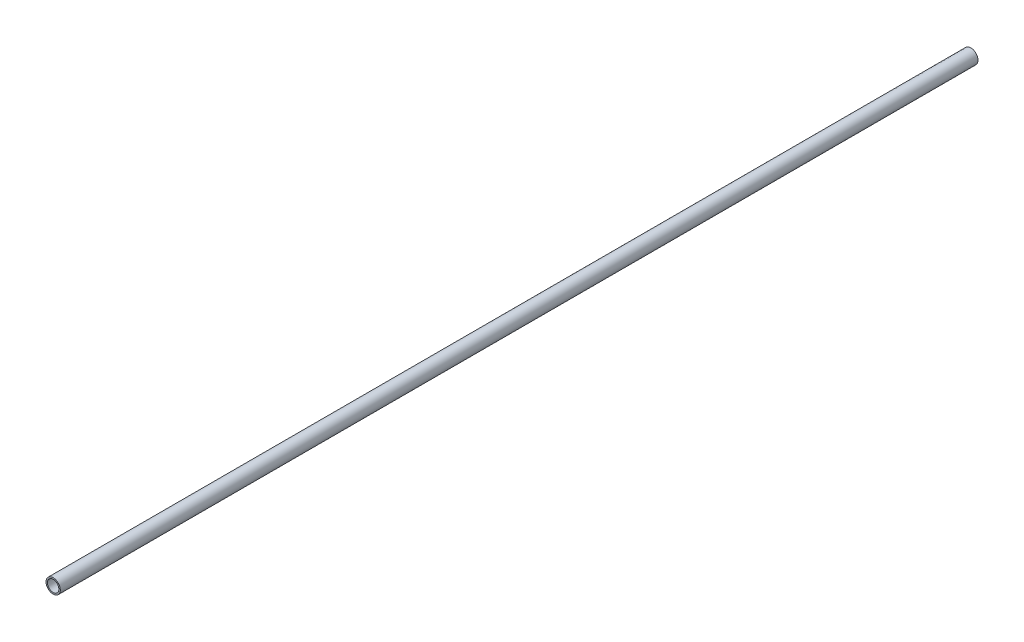
ISO-10303-21;
HEADER;
FILE_DESCRIPTION(('STEP AP214'),'2;1');
FILE_NAME('part.step','',(''),(''),'','','');
FILE_SCHEMA(('AUTOMOTIVE_DESIGN { 1 0 10303 214 1 1 1 1 }'));
ENDSEC;
DATA;
#1=APPLICATION_CONTEXT('core data for automotive mechanical design processes');
#2=APPLICATION_PROTOCOL_DEFINITION('international standard','automotive_design',2000,#1);
#3=PRODUCT_CONTEXT('',#1,'mechanical');
#4=PRODUCT('Part','Part','',(#3));
#5=PRODUCT_RELATED_PRODUCT_CATEGORY('part','',(#4));
#6=PRODUCT_DEFINITION_FORMATION('','',#4);
#7=PRODUCT_DEFINITION_CONTEXT('part definition',#1,'design');
#8=PRODUCT_DEFINITION('design','',#6,#7);
#9=PRODUCT_DEFINITION_SHAPE('','',#8);
#10=(LENGTH_UNIT() NAMED_UNIT(*) SI_UNIT(.MILLI.,.METRE.));
#11=(NAMED_UNIT(*) PLANE_ANGLE_UNIT() SI_UNIT($,.RADIAN.));
#12=(NAMED_UNIT(*) SI_UNIT($,.STERADIAN.) SOLID_ANGLE_UNIT());
#13=UNCERTAINTY_MEASURE_WITH_UNIT(LENGTH_MEASURE(1.E-05),#10,'distance_accuracy_value','');
#14=(GEOMETRIC_REPRESENTATION_CONTEXT(3) GLOBAL_UNCERTAINTY_ASSIGNED_CONTEXT((#13)) GLOBAL_UNIT_ASSIGNED_CONTEXT((#10,
#11,#12)) REPRESENTATION_CONTEXT('',''));
#15=CARTESIAN_POINT('',(0.,0.,0.));
#16=DIRECTION('',(0.,0.,1.));
#17=DIRECTION('',(1.,0.,0.));
#18=AXIS2_PLACEMENT_3D('',#15,#16,#17);
#19=CARTESIAN_POINT('',(0.,0.,0.));
#20=DIRECTION('',(0.,0.,1.));
#21=DIRECTION('',(1.,0.,0.));
#22=AXIS2_PLACEMENT_3D('',#19,#20,#21);
#23=CYLINDRICAL_SURFACE('',#22,13.3223);
#24=CARTESIAN_POINT('',(0.,0.,2143.252));
#25=DIRECTION('',(0.,0.,1.));
#26=DIRECTION('',(1.,0.,0.));
#27=AXIS2_PLACEMENT_3D('',#24,#25,#26);
#28=CIRCLE('',#27,13.3223);
#29=CARTESIAN_POINT('',(13.3223,0.,2143.252));
#30=VERTEX_POINT('',#29);
#31=EDGE_CURVE('E9',#30,#30,#28,.T.);
#32=ORIENTED_EDGE('',*,*,#31,.T.);
#33=EDGE_LOOP('',(#32));
#34=FACE_BOUND('',#33,.T.);
#35=CARTESIAN_POINT('',(0.,0.,0.));
#36=DIRECTION('',(0.,0.,1.));
#37=DIRECTION('',(1.,0.,0.));
#38=AXIS2_PLACEMENT_3D('',#35,#36,#37);
#39=CIRCLE('',#38,13.3223);
#40=CARTESIAN_POINT('',(13.3223,0.,0.));
#41=VERTEX_POINT('',#40);
#42=EDGE_CURVE('E28',#41,#41,#39,.T.);
#43=ORIENTED_EDGE('',*,*,#42,.F.);
#44=EDGE_LOOP('',(#43));
#45=FACE_BOUND('',#44,.T.);
#46=ADVANCED_FACE('F14',(#34,#45),#23,.F.);
#47=CARTESIAN_POINT('',(0.,0.,0.));
#48=DIRECTION('',(0.,0.,1.));
#49=DIRECTION('',(1.,0.,0.));
#50=AXIS2_PLACEMENT_3D('',#47,#48,#49);
#51=CYLINDRICAL_SURFACE('',#50,16.7005);
#52=CARTESIAN_POINT('',(0.,0.,2143.252));
#53=DIRECTION('',(0.,0.,-1.));
#54=DIRECTION('',(0.,-1.,0.));
#55=AXIS2_PLACEMENT_3D('',#52,#53,#54);
#56=CIRCLE('',#55,16.7005);
#57=CARTESIAN_POINT('',(0.,-16.7005,2143.252));
#58=VERTEX_POINT('',#57);
#59=EDGE_CURVE('E22',#58,#58,#56,.T.);
#60=ORIENTED_EDGE('',*,*,#59,.T.);
#61=EDGE_LOOP('',(#60));
#62=FACE_BOUND('',#61,.T.);
#63=CARTESIAN_POINT('',(0.,0.,0.));
#64=DIRECTION('',(0.,0.,-1.));
#65=DIRECTION('',(0.,-1.,0.));
#66=AXIS2_PLACEMENT_3D('',#63,#64,#65);
#67=CIRCLE('',#66,16.7005);
#68=CARTESIAN_POINT('',(0.,-16.7005,0.));
#69=VERTEX_POINT('',#68);
#70=EDGE_CURVE('E18',#69,#69,#67,.T.);
#71=ORIENTED_EDGE('',*,*,#70,.F.);
#72=EDGE_LOOP('',(#71));
#73=FACE_BOUND('',#72,.T.);
#74=ADVANCED_FACE('F16',(#62,#73),#51,.T.);
#75=CARTESIAN_POINT('',(0.,0.,0.));
#76=DIRECTION('',(0.,0.,1.));
#77=DIRECTION('',(1.,0.,0.));
#78=AXIS2_PLACEMENT_3D('',#75,#76,#77);
#79=PLANE('',#78);
#80=ORIENTED_EDGE('',*,*,#70,.T.);
#81=EDGE_LOOP('',(#80));
#82=FACE_BOUND('',#81,.T.);
#83=ORIENTED_EDGE('',*,*,#42,.T.);
#84=EDGE_LOOP('',(#83));
#85=FACE_BOUND('',#84,.T.);
#86=ADVANCED_FACE('F35',(#82,#85),#79,.F.);
#87=CARTESIAN_POINT('',(0.,0.,2143.252));
#88=DIRECTION('',(0.,0.,1.));
#89=DIRECTION('',(1.,0.,0.));
#90=AXIS2_PLACEMENT_3D('',#87,#88,#89);
#91=PLANE('',#90);
#92=ORIENTED_EDGE('',*,*,#59,.F.);
#93=EDGE_LOOP('',(#92));
#94=FACE_BOUND('',#93,.T.);
#95=ORIENTED_EDGE('',*,*,#31,.F.);
#96=EDGE_LOOP('',(#95));
#97=FACE_BOUND('',#96,.T.);
#98=ADVANCED_FACE('F44',(#94,#97),#91,.T.);
#99=CLOSED_SHELL('',(#46,#74,#86,#98));
#100=MANIFOLD_SOLID_BREP('B1',#99);
#101=ADVANCED_BREP_SHAPE_REPRESENTATION('',(#18,#100),#14);
#102=SHAPE_DEFINITION_REPRESENTATION(#9,#101);
ENDSEC;
END-ISO-10303-21;
